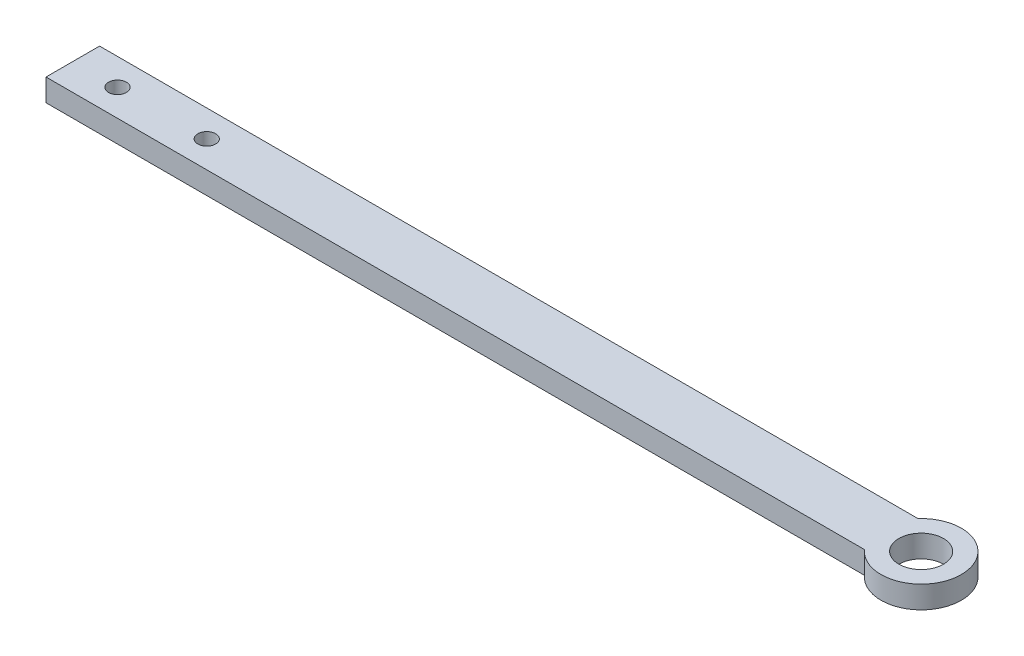
ISO-10303-21;
HEADER;
FILE_DESCRIPTION(('STEP AP214'),'2;1');
FILE_NAME('part.step','',(''),(''),'','','');
FILE_SCHEMA(('AUTOMOTIVE_DESIGN { 1 0 10303 214 1 1 1 1 }'));
ENDSEC;
DATA;
#1=APPLICATION_CONTEXT('core data for automotive mechanical design processes');
#2=APPLICATION_PROTOCOL_DEFINITION('international standard','automotive_design',2000,#1);
#3=PRODUCT_CONTEXT('',#1,'mechanical');
#4=PRODUCT('Part','Part','',(#3));
#5=PRODUCT_RELATED_PRODUCT_CATEGORY('part','',(#4));
#6=PRODUCT_DEFINITION_FORMATION('','',#4);
#7=PRODUCT_DEFINITION_CONTEXT('part definition',#1,'design');
#8=PRODUCT_DEFINITION('design','',#6,#7);
#9=PRODUCT_DEFINITION_SHAPE('','',#8);
#10=(LENGTH_UNIT() NAMED_UNIT(*) SI_UNIT(.MILLI.,.METRE.));
#11=(NAMED_UNIT(*) PLANE_ANGLE_UNIT() SI_UNIT($,.RADIAN.));
#12=(NAMED_UNIT(*) SI_UNIT($,.STERADIAN.) SOLID_ANGLE_UNIT());
#13=UNCERTAINTY_MEASURE_WITH_UNIT(LENGTH_MEASURE(1.E-05),#10,'distance_accuracy_value','');
#14=(GEOMETRIC_REPRESENTATION_CONTEXT(3) GLOBAL_UNCERTAINTY_ASSIGNED_CONTEXT((#13)) GLOBAL_UNIT_ASSIGNED_CONTEXT((#10,
#11,#12)) REPRESENTATION_CONTEXT('',''));
#15=CARTESIAN_POINT('',(0.,0.,0.));
#16=DIRECTION('',(0.,0.,1.));
#17=DIRECTION('',(1.,0.,0.));
#18=AXIS2_PLACEMENT_3D('',#15,#16,#17);
#19=CARTESIAN_POINT('',(-190.,5.,-5.99999999999998));
#20=DIRECTION('',(1.,0.,0.));
#21=DIRECTION('',(0.,0.,-1.));
#22=AXIS2_PLACEMENT_3D('',#19,#20,#21);
#23=PLANE('',#22);
#24=DIRECTION('',(0.,0.,1.));
#25=VECTOR('',#24,1.);
#26=CARTESIAN_POINT('',(-190.,0.,-5.99999999999998));
#27=LINE('',#26,#25);
#28=CARTESIAN_POINT('',(-190.,0.,-5.99999999999998));
#29=VERTEX_POINT('',#28);
#30=CARTESIAN_POINT('',(-190.,0.,5.99999999999998));
#31=VERTEX_POINT('',#30);
#32=EDGE_CURVE('E113',#29,#31,#27,.T.);
#33=ORIENTED_EDGE('',*,*,#32,.T.);
#34=DIRECTION('',(0.,-1.,0.));
#35=VECTOR('',#34,1.);
#36=CARTESIAN_POINT('',(-190.,5.,5.99999999999998));
#37=LINE('',#36,#35);
#38=CARTESIAN_POINT('',(-190.,5.,5.99999999999998));
#39=VERTEX_POINT('',#38);
#40=EDGE_CURVE('E11',#39,#31,#37,.T.);
#41=ORIENTED_EDGE('',*,*,#40,.F.);
#42=DIRECTION('',(0.,0.,1.));
#43=VECTOR('',#42,1.);
#44=CARTESIAN_POINT('',(-190.,5.,-5.99999999999998));
#45=LINE('',#44,#43);
#46=CARTESIAN_POINT('',(-190.,5.,-5.99999999999998));
#47=VERTEX_POINT('',#46);
#48=EDGE_CURVE('E97',#47,#39,#45,.T.);
#49=ORIENTED_EDGE('',*,*,#48,.F.);
#50=DIRECTION('',(0.,-1.,0.));
#51=VECTOR('',#50,1.);
#52=CARTESIAN_POINT('',(-190.,5.,-5.99999999999998));
#53=LINE('',#52,#51);
#54=EDGE_CURVE('E109',#47,#29,#53,.T.);
#55=ORIENTED_EDGE('',*,*,#54,.T.);
#56=EDGE_LOOP('',(#33,#41,#49,#55));
#57=FACE_BOUND('',#56,.T.);
#58=ADVANCED_FACE('F45',(#57),#23,.F.);
#59=CARTESIAN_POINT('',(-190.,5.,5.99999999999998));
#60=DIRECTION('',(0.,0.,-1.));
#61=DIRECTION('',(-1.,0.,0.));
#62=AXIS2_PLACEMENT_3D('',#59,#60,#61);
#63=PLANE('',#62);
#64=DIRECTION('',(1.,0.,0.));
#65=VECTOR('',#64,1.);
#66=CARTESIAN_POINT('',(-190.,0.,5.99999999999998));
#67=LINE('',#66,#65);
#68=CARTESIAN_POINT('',(-6.70820393249937,0.,6.));
#69=VERTEX_POINT('',#68);
#70=EDGE_CURVE('E102',#31,#69,#67,.T.);
#71=ORIENTED_EDGE('',*,*,#70,.T.);
#72=DIRECTION('',(0.,-1.,0.));
#73=VECTOR('',#72,1.);
#74=CARTESIAN_POINT('',(-6.70820393249937,5.,6.));
#75=LINE('',#74,#73);
#76=CARTESIAN_POINT('',(-6.70820393249937,5.,6.));
#77=VERTEX_POINT('',#76);
#78=EDGE_CURVE('E54',#77,#69,#75,.T.);
#79=ORIENTED_EDGE('',*,*,#78,.F.);
#80=DIRECTION('',(1.,0.,0.));
#81=VECTOR('',#80,1.);
#82=CARTESIAN_POINT('',(-190.,5.,5.99999999999998));
#83=LINE('',#82,#81);
#84=EDGE_CURVE('E92',#39,#77,#83,.T.);
#85=ORIENTED_EDGE('',*,*,#84,.F.);
#86=ORIENTED_EDGE('',*,*,#40,.T.);
#87=EDGE_LOOP('',(#71,#79,#85,#86));
#88=FACE_BOUND('',#87,.T.);
#89=ADVANCED_FACE('F101',(#88),#63,.F.);
#90=CARTESIAN_POINT('',(0.,5.,0.));
#91=DIRECTION('',(0.,-1.,0.));
#92=DIRECTION('',(0.,0.,-1.));
#93=AXIS2_PLACEMENT_3D('',#90,#91,#92);
#94=CYLINDRICAL_SURFACE('',#93,9.);
#95=CARTESIAN_POINT('',(0.,0.,0.));
#96=DIRECTION('',(0.,1.,0.));
#97=DIRECTION('',(0.,0.,1.));
#98=AXIS2_PLACEMENT_3D('',#95,#96,#97);
#99=CIRCLE('',#98,9.);
#100=CARTESIAN_POINT('',(-6.70820393249937,0.,-6.));
#101=VERTEX_POINT('',#100);
#102=EDGE_CURVE('E79',#69,#101,#99,.T.);
#103=ORIENTED_EDGE('',*,*,#102,.T.);
#104=DIRECTION('',(0.,-1.,0.));
#105=VECTOR('',#104,1.);
#106=CARTESIAN_POINT('',(-6.70820393249937,5.,-6.));
#107=LINE('',#106,#105);
#108=CARTESIAN_POINT('',(-6.70820393249937,5.,-6.));
#109=VERTEX_POINT('',#108);
#110=EDGE_CURVE('E104',#109,#101,#107,.T.);
#111=ORIENTED_EDGE('',*,*,#110,.F.);
#112=CARTESIAN_POINT('',(0.,5.,0.));
#113=DIRECTION('',(0.,1.,0.));
#114=DIRECTION('',(0.,0.,1.));
#115=AXIS2_PLACEMENT_3D('',#112,#113,#114);
#116=CIRCLE('',#115,9.);
#117=EDGE_CURVE('E95',#77,#109,#116,.T.);
#118=ORIENTED_EDGE('',*,*,#117,.F.);
#119=ORIENTED_EDGE('',*,*,#78,.T.);
#120=EDGE_LOOP('',(#103,#111,#118,#119));
#121=FACE_BOUND('',#120,.T.);
#122=ADVANCED_FACE('F105',(#121),#94,.T.);
#123=CARTESIAN_POINT('',(-6.70820393249937,5.,-6.));
#124=DIRECTION('',(0.,0.,1.));
#125=DIRECTION('',(1.,0.,0.));
#126=AXIS2_PLACEMENT_3D('',#123,#124,#125);
#127=PLANE('',#126);
#128=DIRECTION('',(-1.,0.,0.));
#129=VECTOR('',#128,1.);
#130=CARTESIAN_POINT('',(-6.70820393249937,0.,-6.));
#131=LINE('',#130,#129);
#132=EDGE_CURVE('E85',#101,#29,#131,.T.);
#133=ORIENTED_EDGE('',*,*,#132,.T.);
#134=ORIENTED_EDGE('',*,*,#54,.F.);
#135=DIRECTION('',(-1.,0.,0.));
#136=VECTOR('',#135,1.);
#137=CARTESIAN_POINT('',(-6.70820393249937,5.,-6.));
#138=LINE('',#137,#136);
#139=EDGE_CURVE('E62',#109,#47,#138,.T.);
#140=ORIENTED_EDGE('',*,*,#139,.F.);
#141=ORIENTED_EDGE('',*,*,#110,.T.);
#142=EDGE_LOOP('',(#133,#134,#140,#141));
#143=FACE_BOUND('',#142,.T.);
#144=ADVANCED_FACE('F127',(#143),#127,.F.);
#145=CARTESIAN_POINT('',(0.,5.,0.));
#146=DIRECTION('',(0.,1.,0.));
#147=DIRECTION('',(0.,0.,1.));
#148=AXIS2_PLACEMENT_3D('',#145,#146,#147);
#149=PLANE('',#148);
#150=CARTESIAN_POINT('',(0.,5.,0.));
#151=DIRECTION('',(0.,1.,0.));
#152=DIRECTION('',(0.,0.,1.));
#153=AXIS2_PLACEMENT_3D('',#150,#151,#152);
#154=CIRCLE('',#153,5.);
#155=CARTESIAN_POINT('',(0.,5.,5.));
#156=VERTEX_POINT('',#155);
#157=EDGE_CURVE('E150',#156,#156,#154,.T.);
#158=ORIENTED_EDGE('',*,*,#157,.F.);
#159=EDGE_LOOP('',(#158));
#160=FACE_BOUND('',#159,.T.);
#161=CARTESIAN_POINT('',(-180.,5.,0.));
#162=DIRECTION('',(0.,1.,0.));
#163=DIRECTION('',(0.,0.,1.));
#164=AXIS2_PLACEMENT_3D('',#161,#162,#163);
#165=CIRCLE('',#164,2.);
#166=CARTESIAN_POINT('',(-180.,5.,2.));
#167=VERTEX_POINT('',#166);
#168=EDGE_CURVE('E146',#167,#167,#165,.T.);
#169=ORIENTED_EDGE('',*,*,#168,.F.);
#170=EDGE_LOOP('',(#169));
#171=FACE_BOUND('',#170,.T.);
#172=CARTESIAN_POINT('',(-160.,5.,0.));
#173=DIRECTION('',(0.,1.,0.));
#174=DIRECTION('',(0.,0.,1.));
#175=AXIS2_PLACEMENT_3D('',#172,#173,#174);
#176=CIRCLE('',#175,2.);
#177=CARTESIAN_POINT('',(-160.,5.,2.));
#178=VERTEX_POINT('',#177);
#179=EDGE_CURVE('E138',#178,#178,#176,.T.);
#180=ORIENTED_EDGE('',*,*,#179,.F.);
#181=EDGE_LOOP('',(#180));
#182=FACE_BOUND('',#181,.T.);
#183=ORIENTED_EDGE('',*,*,#48,.T.);
#184=ORIENTED_EDGE('',*,*,#84,.T.);
#185=ORIENTED_EDGE('',*,*,#117,.T.);
#186=ORIENTED_EDGE('',*,*,#139,.T.);
#187=EDGE_LOOP('',(#183,#184,#185,#186));
#188=FACE_BOUND('',#187,.T.);
#189=ADVANCED_FACE('F93',(#160,#171,#182,#188),#149,.T.);
#190=CARTESIAN_POINT('',(0.,0.,0.));
#191=DIRECTION('',(0.,1.,0.));
#192=DIRECTION('',(0.,0.,1.));
#193=AXIS2_PLACEMENT_3D('',#190,#191,#192);
#194=PLANE('',#193);
#195=CARTESIAN_POINT('',(0.,0.,0.));
#196=DIRECTION('',(0.,1.,0.));
#197=DIRECTION('',(0.,0.,1.));
#198=AXIS2_PLACEMENT_3D('',#195,#196,#197);
#199=CIRCLE('',#198,5.);
#200=CARTESIAN_POINT('',(0.,0.,5.));
#201=VERTEX_POINT('',#200);
#202=EDGE_CURVE('E117',#201,#201,#199,.T.);
#203=ORIENTED_EDGE('',*,*,#202,.T.);
#204=EDGE_LOOP('',(#203));
#205=FACE_BOUND('',#204,.T.);
#206=CARTESIAN_POINT('',(-180.,0.,0.));
#207=DIRECTION('',(0.,1.,0.));
#208=DIRECTION('',(0.,0.,1.));
#209=AXIS2_PLACEMENT_3D('',#206,#207,#208);
#210=CIRCLE('',#209,2.);
#211=CARTESIAN_POINT('',(-180.,0.,2.));
#212=VERTEX_POINT('',#211);
#213=EDGE_CURVE('E142',#212,#212,#210,.T.);
#214=ORIENTED_EDGE('',*,*,#213,.T.);
#215=EDGE_LOOP('',(#214));
#216=FACE_BOUND('',#215,.T.);
#217=CARTESIAN_POINT('',(-160.,0.,0.));
#218=DIRECTION('',(0.,1.,0.));
#219=DIRECTION('',(0.,0.,1.));
#220=AXIS2_PLACEMENT_3D('',#217,#218,#219);
#221=CIRCLE('',#220,2.);
#222=CARTESIAN_POINT('',(-160.,0.,2.));
#223=VERTEX_POINT('',#222);
#224=EDGE_CURVE('E134',#223,#223,#221,.T.);
#225=ORIENTED_EDGE('',*,*,#224,.T.);
#226=EDGE_LOOP('',(#225));
#227=FACE_BOUND('',#226,.T.);
#228=ORIENTED_EDGE('',*,*,#32,.F.);
#229=ORIENTED_EDGE('',*,*,#132,.F.);
#230=ORIENTED_EDGE('',*,*,#102,.F.);
#231=ORIENTED_EDGE('',*,*,#70,.F.);
#232=EDGE_LOOP('',(#228,#229,#230,#231));
#233=FACE_BOUND('',#232,.T.);
#234=ADVANCED_FACE('F130',(#205,#216,#227,#233),#194,.F.);
#235=CARTESIAN_POINT('',(-160.,0.,0.));
#236=DIRECTION('',(0.,1.,0.));
#237=DIRECTION('',(0.,0.,1.));
#238=AXIS2_PLACEMENT_3D('',#235,#236,#237);
#239=CYLINDRICAL_SURFACE('',#238,2.);
#240=ORIENTED_EDGE('',*,*,#224,.F.);
#241=EDGE_LOOP('',(#240));
#242=FACE_BOUND('',#241,.T.);
#243=ORIENTED_EDGE('',*,*,#179,.T.);
#244=EDGE_LOOP('',(#243));
#245=FACE_BOUND('',#244,.T.);
#246=ADVANCED_FACE('F174',(#242,#245),#239,.F.);
#247=CARTESIAN_POINT('',(-180.,0.,0.));
#248=DIRECTION('',(0.,1.,0.));
#249=DIRECTION('',(0.,0.,1.));
#250=AXIS2_PLACEMENT_3D('',#247,#248,#249);
#251=CYLINDRICAL_SURFACE('',#250,2.);
#252=ORIENTED_EDGE('',*,*,#213,.F.);
#253=EDGE_LOOP('',(#252));
#254=FACE_BOUND('',#253,.T.);
#255=ORIENTED_EDGE('',*,*,#168,.T.);
#256=EDGE_LOOP('',(#255));
#257=FACE_BOUND('',#256,.T.);
#258=ADVANCED_FACE('F163',(#254,#257),#251,.F.);
#259=CARTESIAN_POINT('',(0.,0.,0.));
#260=DIRECTION('',(0.,1.,0.));
#261=DIRECTION('',(0.,0.,1.));
#262=AXIS2_PLACEMENT_3D('',#259,#260,#261);
#263=CYLINDRICAL_SURFACE('',#262,5.);
#264=ORIENTED_EDGE('',*,*,#202,.F.);
#265=EDGE_LOOP('',(#264));
#266=FACE_BOUND('',#265,.T.);
#267=ORIENTED_EDGE('',*,*,#157,.T.);
#268=EDGE_LOOP('',(#267));
#269=FACE_BOUND('',#268,.T.);
#270=ADVANCED_FACE('F160',(#266,#269),#263,.F.);
#271=CLOSED_SHELL('',(#58,#89,#122,#144,#189,#234,#246,#258,#270));
#272=MANIFOLD_SOLID_BREP('B2',#271);
#273=ADVANCED_BREP_SHAPE_REPRESENTATION('',(#18,#272),#14);
#274=SHAPE_DEFINITION_REPRESENTATION(#9,#273);
ENDSEC;
END-ISO-10303-21;
